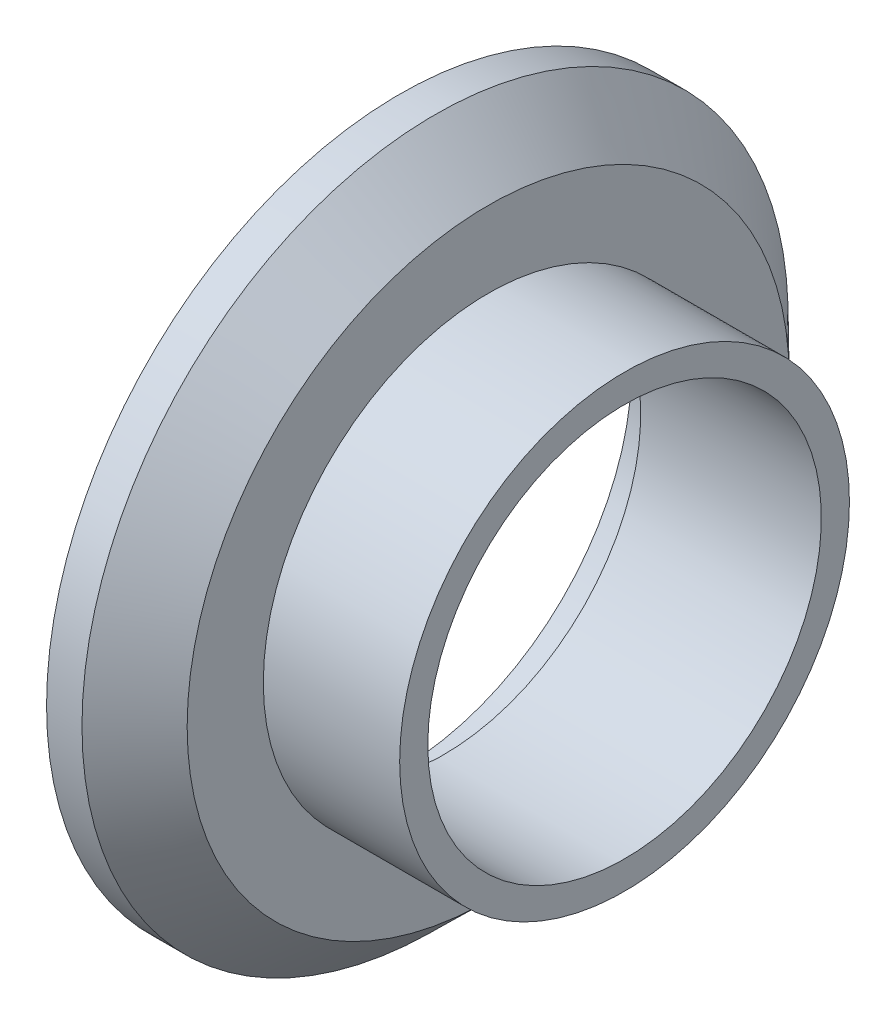
ISO-10303-21;
HEADER;
FILE_DESCRIPTION(('STEP AP214'),'2;1');
FILE_NAME('part.step','',(''),(''),'','','');
FILE_SCHEMA(('AUTOMOTIVE_DESIGN { 1 0 10303 214 1 1 1 1 }'));
ENDSEC;
DATA;
#1=APPLICATION_CONTEXT('core data for automotive mechanical design processes');
#2=APPLICATION_PROTOCOL_DEFINITION('international standard','automotive_design',2000,#1);
#3=PRODUCT_CONTEXT('',#1,'mechanical');
#4=PRODUCT('Part','Part','',(#3));
#5=PRODUCT_RELATED_PRODUCT_CATEGORY('part','',(#4));
#6=PRODUCT_DEFINITION_FORMATION('','',#4);
#7=PRODUCT_DEFINITION_CONTEXT('part definition',#1,'design');
#8=PRODUCT_DEFINITION('design','',#6,#7);
#9=PRODUCT_DEFINITION_SHAPE('','',#8);
#10=(LENGTH_UNIT() NAMED_UNIT(*) SI_UNIT(.MILLI.,.METRE.));
#11=(NAMED_UNIT(*) PLANE_ANGLE_UNIT() SI_UNIT($,.RADIAN.));
#12=(NAMED_UNIT(*) SI_UNIT($,.STERADIAN.) SOLID_ANGLE_UNIT());
#13=UNCERTAINTY_MEASURE_WITH_UNIT(LENGTH_MEASURE(1.E-05),#10,'distance_accuracy_value','');
#14=(GEOMETRIC_REPRESENTATION_CONTEXT(3) GLOBAL_UNCERTAINTY_ASSIGNED_CONTEXT((#13)) GLOBAL_UNIT_ASSIGNED_CONTEXT((#10,
#11,#12)) REPRESENTATION_CONTEXT('',''));
#15=CARTESIAN_POINT('',(0.,0.,0.));
#16=DIRECTION('',(0.,0.,1.));
#17=DIRECTION('',(1.,0.,0.));
#18=AXIS2_PLACEMENT_3D('',#15,#16,#17);
#19=CARTESIAN_POINT('',(3.5,13.1,0.));
#20=DIRECTION('',(1.,0.,0.));
#21=DIRECTION('',(0.,0.,-1.));
#22=AXIS2_PLACEMENT_3D('',#19,#20,#21);
#23=PLANE('',#22);
#24=CARTESIAN_POINT('',(3.5,0.,0.));
#25=DIRECTION('',(-1.,0.,0.));
#26=DIRECTION('',(0.,0.,1.));
#27=AXIS2_PLACEMENT_3D('',#24,#25,#26);
#28=CIRCLE('',#27,11.1125);
#29=CARTESIAN_POINT('',(3.5,0.,11.1125));
#30=VERTEX_POINT('',#29);
#31=EDGE_CURVE('E10',#30,#30,#28,.T.);
#32=ORIENTED_EDGE('',*,*,#31,.F.);
#33=EDGE_LOOP('',(#32));
#34=FACE_BOUND('',#33,.T.);
#35=CARTESIAN_POINT('',(3.5,0.,0.));
#36=DIRECTION('',(-1.,0.,0.));
#37=DIRECTION('',(0.,0.,1.));
#38=AXIS2_PLACEMENT_3D('',#35,#36,#37);
#39=CIRCLE('',#38,13.1);
#40=CARTESIAN_POINT('',(3.5,0.,13.1));
#41=VERTEX_POINT('',#40);
#42=EDGE_CURVE('E62',#41,#41,#39,.T.);
#43=ORIENTED_EDGE('',*,*,#42,.T.);
#44=EDGE_LOOP('',(#43));
#45=FACE_BOUND('',#44,.T.);
#46=ADVANCED_FACE('F31',(#34,#45),#23,.F.);
#47=CARTESIAN_POINT('',(-110.,0.,0.));
#48=DIRECTION('',(-1.,0.,0.));
#49=DIRECTION('',(0.,0.,1.));
#50=AXIS2_PLACEMENT_3D('',#47,#48,#49);
#51=CYLINDRICAL_SURFACE('',#50,11.1125);
#52=CARTESIAN_POINT('',(13.7,0.,0.));
#53=DIRECTION('',(-1.,0.,0.));
#54=DIRECTION('',(0.,0.,1.));
#55=AXIS2_PLACEMENT_3D('',#52,#53,#54);
#56=CIRCLE('',#55,11.1125);
#57=CARTESIAN_POINT('',(13.7,0.,11.1125));
#58=VERTEX_POINT('',#57);
#59=EDGE_CURVE('E37',#58,#58,#56,.T.);
#60=ORIENTED_EDGE('',*,*,#59,.F.);
#61=EDGE_LOOP('',(#60));
#62=FACE_BOUND('',#61,.T.);
#63=ORIENTED_EDGE('',*,*,#31,.T.);
#64=EDGE_LOOP('',(#63));
#65=FACE_BOUND('',#64,.T.);
#66=ADVANCED_FACE('F105',(#62,#65),#51,.F.);
#67=CARTESIAN_POINT('',(13.7,11.1125,0.));
#68=DIRECTION('',(-1.,0.,0.));
#69=DIRECTION('',(0.,0.,1.));
#70=AXIS2_PLACEMENT_3D('',#67,#68,#69);
#71=PLANE('',#70);
#72=CARTESIAN_POINT('',(13.7,0.,0.));
#73=DIRECTION('',(-1.,0.,0.));
#74=DIRECTION('',(0.,0.,1.));
#75=AXIS2_PLACEMENT_3D('',#72,#73,#74);
#76=CIRCLE('',#75,12.7);
#77=CARTESIAN_POINT('',(13.7,0.,12.7));
#78=VERTEX_POINT('',#77);
#79=EDGE_CURVE('E41',#78,#78,#76,.T.);
#80=ORIENTED_EDGE('',*,*,#79,.F.);
#81=EDGE_LOOP('',(#80));
#82=FACE_BOUND('',#81,.T.);
#83=ORIENTED_EDGE('',*,*,#59,.T.);
#84=EDGE_LOOP('',(#83));
#85=FACE_BOUND('',#84,.T.);
#86=ADVANCED_FACE('F100',(#82,#85),#71,.F.);
#87=CARTESIAN_POINT('',(-110.,0.,0.));
#88=DIRECTION('',(-1.,0.,0.));
#89=DIRECTION('',(0.,0.,1.));
#90=AXIS2_PLACEMENT_3D('',#87,#88,#89);
#91=CYLINDRICAL_SURFACE('',#90,12.7);
#92=CARTESIAN_POINT('',(6.00000000000001,0.,0.));
#93=DIRECTION('',(-1.,0.,0.));
#94=DIRECTION('',(0.,0.,1.));
#95=AXIS2_PLACEMENT_3D('',#92,#93,#94);
#96=CIRCLE('',#95,12.7);
#97=CARTESIAN_POINT('',(6.00000000000001,0.,12.7));
#98=VERTEX_POINT('',#97);
#99=EDGE_CURVE('E45',#98,#98,#96,.T.);
#100=ORIENTED_EDGE('',*,*,#99,.F.);
#101=EDGE_LOOP('',(#100));
#102=FACE_BOUND('',#101,.T.);
#103=ORIENTED_EDGE('',*,*,#79,.T.);
#104=EDGE_LOOP('',(#103));
#105=FACE_BOUND('',#104,.T.);
#106=ADVANCED_FACE('F94',(#102,#105),#91,.T.);
#107=CARTESIAN_POINT('',(6.,12.7,0.));
#108=DIRECTION('',(-1.,0.,0.));
#109=DIRECTION('',(0.,0.,1.));
#110=AXIS2_PLACEMENT_3D('',#107,#108,#109);
#111=PLANE('',#110);
#112=CARTESIAN_POINT('',(6.00000000000001,0.,0.));
#113=DIRECTION('',(-1.,0.,0.));
#114=DIRECTION('',(0.,0.,1.));
#115=AXIS2_PLACEMENT_3D('',#112,#113,#114);
#116=CIRCLE('',#115,17.);
#117=CARTESIAN_POINT('',(6.00000000000001,0.,17.));
#118=VERTEX_POINT('',#117);
#119=EDGE_CURVE('E50',#118,#118,#116,.T.);
#120=ORIENTED_EDGE('',*,*,#119,.F.);
#121=EDGE_LOOP('',(#120));
#122=FACE_BOUND('',#121,.T.);
#123=ORIENTED_EDGE('',*,*,#99,.T.);
#124=EDGE_LOOP('',(#123));
#125=FACE_BOUND('',#124,.T.);
#126=ADVANCED_FACE('F88',(#122,#125),#111,.F.);
#127=CARTESIAN_POINT('',(6.00000000000001,0.,0.));
#128=DIRECTION('',(-1.,0.,0.));
#129=DIRECTION('',(0.,0.,1.));
#130=AXIS2_PLACEMENT_3D('',#127,#128,#129);
#131=CONICAL_SURFACE('',#130,17.,0.775297496812126);
#132=CARTESIAN_POINT('',(3.,0.,0.));
#133=DIRECTION('',(-1.,0.,0.));
#134=DIRECTION('',(0.,0.,1.));
#135=AXIS2_PLACEMENT_3D('',#132,#133,#134);
#136=CIRCLE('',#135,19.94);
#137=CARTESIAN_POINT('',(3.,0.,19.94));
#138=VERTEX_POINT('',#137);
#139=EDGE_CURVE('E53',#138,#138,#136,.T.);
#140=ORIENTED_EDGE('',*,*,#139,.F.);
#141=EDGE_LOOP('',(#140));
#142=FACE_BOUND('',#141,.T.);
#143=ORIENTED_EDGE('',*,*,#119,.T.);
#144=EDGE_LOOP('',(#143));
#145=FACE_BOUND('',#144,.T.);
#146=ADVANCED_FACE('F82',(#142,#145),#131,.T.);
#147=CARTESIAN_POINT('',(-110.,0.,0.));
#148=DIRECTION('',(-1.,0.,0.));
#149=DIRECTION('',(0.,0.,1.));
#150=AXIS2_PLACEMENT_3D('',#147,#148,#149);
#151=CYLINDRICAL_SURFACE('',#150,19.94);
#152=CARTESIAN_POINT('',(1.,0.,0.));
#153=DIRECTION('',(-1.,0.,0.));
#154=DIRECTION('',(0.,0.,1.));
#155=AXIS2_PLACEMENT_3D('',#152,#153,#154);
#156=CIRCLE('',#155,19.94);
#157=CARTESIAN_POINT('',(1.,0.,19.94));
#158=VERTEX_POINT('',#157);
#159=EDGE_CURVE('E56',#158,#158,#156,.T.);
#160=ORIENTED_EDGE('',*,*,#159,.F.);
#161=EDGE_LOOP('',(#160));
#162=FACE_BOUND('',#161,.T.);
#163=ORIENTED_EDGE('',*,*,#139,.T.);
#164=EDGE_LOOP('',(#163));
#165=FACE_BOUND('',#164,.T.);
#166=ADVANCED_FACE('F76',(#162,#165),#151,.T.);
#167=CARTESIAN_POINT('',(1.,19.94,0.));
#168=DIRECTION('',(1.,0.,0.));
#169=DIRECTION('',(0.,0.,-1.));
#170=AXIS2_PLACEMENT_3D('',#167,#168,#169);
#171=PLANE('',#170);
#172=CARTESIAN_POINT('',(1.,0.,0.));
#173=DIRECTION('',(-1.,0.,0.));
#174=DIRECTION('',(0.,0.,1.));
#175=AXIS2_PLACEMENT_3D('',#172,#173,#174);
#176=CIRCLE('',#175,13.1);
#177=CARTESIAN_POINT('',(1.,0.,13.1));
#178=VERTEX_POINT('',#177);
#179=EDGE_CURVE('E59',#178,#178,#176,.T.);
#180=ORIENTED_EDGE('',*,*,#179,.F.);
#181=EDGE_LOOP('',(#180));
#182=FACE_BOUND('',#181,.T.);
#183=ORIENTED_EDGE('',*,*,#159,.T.);
#184=EDGE_LOOP('',(#183));
#185=FACE_BOUND('',#184,.T.);
#186=ADVANCED_FACE('F70',(#182,#185),#171,.F.);
#187=CARTESIAN_POINT('',(-110.,0.,0.));
#188=DIRECTION('',(-1.,0.,0.));
#189=DIRECTION('',(0.,0.,1.));
#190=AXIS2_PLACEMENT_3D('',#187,#188,#189);
#191=CYLINDRICAL_SURFACE('',#190,13.1);
#192=ORIENTED_EDGE('',*,*,#42,.F.);
#193=EDGE_LOOP('',(#192));
#194=FACE_BOUND('',#193,.T.);
#195=ORIENTED_EDGE('',*,*,#179,.T.);
#196=EDGE_LOOP('',(#195));
#197=FACE_BOUND('',#196,.T.);
#198=ADVANCED_FACE('F67',(#194,#197),#191,.F.);
#199=CLOSED_SHELL('',(#46,#66,#86,#106,#126,#146,#166,#186,#198));
#200=MANIFOLD_SOLID_BREP('B2',#199);
#201=ADVANCED_BREP_SHAPE_REPRESENTATION('',(#18,#200),#14);
#202=SHAPE_DEFINITION_REPRESENTATION(#9,#201);
ENDSEC;
END-ISO-10303-21;
